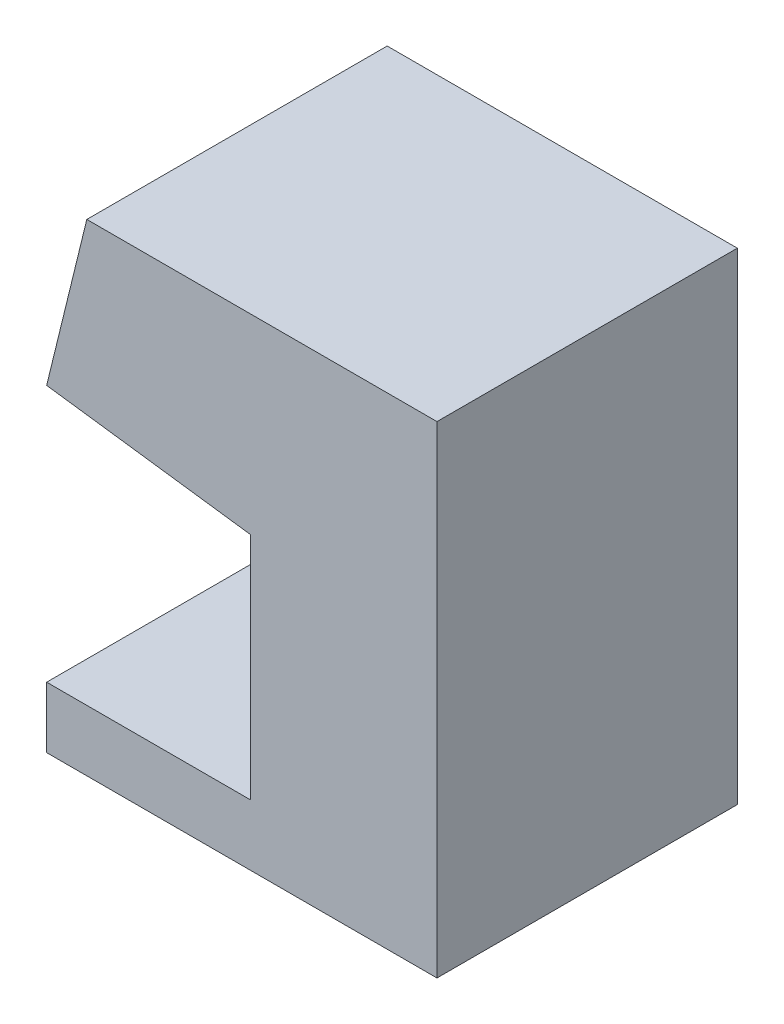
ISO-10303-21;
HEADER;
FILE_DESCRIPTION(('STEP AP214'),'2;1');
FILE_NAME('part.step','',(''),(''),'','','');
FILE_SCHEMA(('AUTOMOTIVE_DESIGN { 1 0 10303 214 1 1 1 1 }'));
ENDSEC;
DATA;
#1=APPLICATION_CONTEXT('core data for automotive mechanical design processes');
#2=APPLICATION_PROTOCOL_DEFINITION('international standard','automotive_design',2000,#1);
#3=PRODUCT_CONTEXT('',#1,'mechanical');
#4=PRODUCT('Part','Part','',(#3));
#5=PRODUCT_RELATED_PRODUCT_CATEGORY('part','',(#4));
#6=PRODUCT_DEFINITION_FORMATION('','',#4);
#7=PRODUCT_DEFINITION_CONTEXT('part definition',#1,'design');
#8=PRODUCT_DEFINITION('design','',#6,#7);
#9=PRODUCT_DEFINITION_SHAPE('','',#8);
#10=(LENGTH_UNIT() NAMED_UNIT(*) SI_UNIT(.MILLI.,.METRE.));
#11=(NAMED_UNIT(*) PLANE_ANGLE_UNIT() SI_UNIT($,.RADIAN.));
#12=(NAMED_UNIT(*) SI_UNIT($,.STERADIAN.) SOLID_ANGLE_UNIT());
#13=UNCERTAINTY_MEASURE_WITH_UNIT(LENGTH_MEASURE(1.E-05),#10,'distance_accuracy_value','');
#14=(GEOMETRIC_REPRESENTATION_CONTEXT(3) GLOBAL_UNCERTAINTY_ASSIGNED_CONTEXT((#13)) GLOBAL_UNIT_ASSIGNED_CONTEXT((#10,
#11,#12)) REPRESENTATION_CONTEXT('',''));
#15=CARTESIAN_POINT('',(0.,0.,0.));
#16=DIRECTION('',(0.,0.,1.));
#17=DIRECTION('',(1.,0.,0.));
#18=AXIS2_PLACEMENT_3D('',#15,#16,#17);
#19=CARTESIAN_POINT('',(0.,38.,187.));
#20=DIRECTION('',(1.,0.,0.));
#21=DIRECTION('',(0.,1.,0.));
#22=AXIS2_PLACEMENT_3D('',#19,#20,#21);
#23=PLANE('',#22);
#24=DIRECTION('',(0.,-1.,0.));
#25=VECTOR('',#24,1.);
#26=CARTESIAN_POINT('',(0.,38.,0.));
#27=LINE('',#26,#25);
#28=CARTESIAN_POINT('',(0.,38.,0.));
#29=VERTEX_POINT('',#28);
#30=CARTESIAN_POINT('',(0.,0.,0.));
#31=VERTEX_POINT('',#30);
#32=EDGE_CURVE('E133',#29,#31,#27,.T.);
#33=ORIENTED_EDGE('',*,*,#32,.T.);
#34=DIRECTION('',(0.,0.,-1.));
#35=VECTOR('',#34,1.);
#36=CARTESIAN_POINT('',(0.,0.,187.));
#37=LINE('',#36,#35);
#38=CARTESIAN_POINT('',(0.,0.,187.));
#39=VERTEX_POINT('',#38);
#40=EDGE_CURVE('E11',#39,#31,#37,.T.);
#41=ORIENTED_EDGE('',*,*,#40,.F.);
#42=DIRECTION('',(0.,-1.,0.));
#43=VECTOR('',#42,1.);
#44=CARTESIAN_POINT('',(0.,38.,187.));
#45=LINE('',#44,#43);
#46=CARTESIAN_POINT('',(0.,38.,187.));
#47=VERTEX_POINT('',#46);
#48=EDGE_CURVE('E147',#47,#39,#45,.T.);
#49=ORIENTED_EDGE('',*,*,#48,.F.);
#50=DIRECTION('',(0.,0.,-1.));
#51=VECTOR('',#50,1.);
#52=CARTESIAN_POINT('',(0.,38.,187.));
#53=LINE('',#52,#51);
#54=EDGE_CURVE('E129',#47,#29,#53,.T.);
#55=ORIENTED_EDGE('',*,*,#54,.T.);
#56=EDGE_LOOP('',(#33,#41,#49,#55));
#57=FACE_BOUND('',#56,.T.);
#58=ADVANCED_FACE('F37',(#57),#23,.F.);
#59=CARTESIAN_POINT('',(0.,0.,187.));
#60=DIRECTION('',(0.,1.,0.));
#61=DIRECTION('',(0.,0.,1.));
#62=AXIS2_PLACEMENT_3D('',#59,#60,#61);
#63=PLANE('',#62);
#64=DIRECTION('',(1.,0.,0.));
#65=VECTOR('',#64,1.);
#66=CARTESIAN_POINT('',(0.,0.,0.));
#67=LINE('',#66,#65);
#68=CARTESIAN_POINT('',(243.,0.,0.));
#69=VERTEX_POINT('',#68);
#70=EDGE_CURVE('E136',#31,#69,#67,.T.);
#71=ORIENTED_EDGE('',*,*,#70,.T.);
#72=DIRECTION('',(0.,0.,-1.));
#73=VECTOR('',#72,1.);
#74=CARTESIAN_POINT('',(243.,0.,187.));
#75=LINE('',#74,#73);
#76=CARTESIAN_POINT('',(243.,0.,187.));
#77=VERTEX_POINT('',#76);
#78=EDGE_CURVE('E45',#77,#69,#75,.T.);
#79=ORIENTED_EDGE('',*,*,#78,.F.);
#80=DIRECTION('',(1.,0.,0.));
#81=VECTOR('',#80,1.);
#82=CARTESIAN_POINT('',(0.,0.,187.));
#83=LINE('',#82,#81);
#84=EDGE_CURVE('E96',#39,#77,#83,.T.);
#85=ORIENTED_EDGE('',*,*,#84,.F.);
#86=ORIENTED_EDGE('',*,*,#40,.T.);
#87=EDGE_LOOP('',(#71,#79,#85,#86));
#88=FACE_BOUND('',#87,.T.);
#89=ADVANCED_FACE('F182',(#88),#63,.F.);
#90=CARTESIAN_POINT('',(243.,0.,187.));
#91=DIRECTION('',(-1.,0.,0.));
#92=DIRECTION('',(0.,-1.,0.));
#93=AXIS2_PLACEMENT_3D('',#90,#91,#92);
#94=PLANE('',#93);
#95=DIRECTION('',(0.,1.,0.));
#96=VECTOR('',#95,1.);
#97=CARTESIAN_POINT('',(243.,0.,0.));
#98=LINE('',#97,#96);
#99=CARTESIAN_POINT('',(243.,300.,0.));
#100=VERTEX_POINT('',#99);
#101=EDGE_CURVE('E138',#69,#100,#98,.T.);
#102=ORIENTED_EDGE('',*,*,#101,.T.);
#103=DIRECTION('',(0.,0.,-1.));
#104=VECTOR('',#103,1.);
#105=CARTESIAN_POINT('',(243.,300.,187.));
#106=LINE('',#105,#104);
#107=CARTESIAN_POINT('',(243.,300.,187.));
#108=VERTEX_POINT('',#107);
#109=EDGE_CURVE('E154',#108,#100,#106,.T.);
#110=ORIENTED_EDGE('',*,*,#109,.F.);
#111=DIRECTION('',(0.,1.,0.));
#112=VECTOR('',#111,1.);
#113=CARTESIAN_POINT('',(243.,0.,187.));
#114=LINE('',#113,#112);
#115=EDGE_CURVE('E162',#77,#108,#114,.T.);
#116=ORIENTED_EDGE('',*,*,#115,.F.);
#117=ORIENTED_EDGE('',*,*,#78,.T.);
#118=EDGE_LOOP('',(#102,#110,#116,#117));
#119=FACE_BOUND('',#118,.T.);
#120=ADVANCED_FACE('F160',(#119),#94,.F.);
#121=CARTESIAN_POINT('',(243.,300.,187.));
#122=DIRECTION('',(0.,-1.,0.));
#123=DIRECTION('',(1.,0.,0.));
#124=AXIS2_PLACEMENT_3D('',#121,#122,#123);
#125=PLANE('',#124);
#126=DIRECTION('',(-1.,0.,0.));
#127=VECTOR('',#126,1.);
#128=CARTESIAN_POINT('',(243.,300.,0.));
#129=LINE('',#128,#127);
#130=CARTESIAN_POINT('',(24.9999999999999,300.,0.));
#131=VERTEX_POINT('',#130);
#132=EDGE_CURVE('E140',#100,#131,#129,.T.);
#133=ORIENTED_EDGE('',*,*,#132,.T.);
#134=DIRECTION('',(0.,0.,-1.));
#135=VECTOR('',#134,1.);
#136=CARTESIAN_POINT('',(24.9999999999999,300.,187.));
#137=LINE('',#136,#135);
#138=CARTESIAN_POINT('',(24.9999999999999,300.,187.));
#139=VERTEX_POINT('',#138);
#140=EDGE_CURVE('E151',#139,#131,#137,.T.);
#141=ORIENTED_EDGE('',*,*,#140,.F.);
#142=DIRECTION('',(-1.,0.,0.));
#143=VECTOR('',#142,1.);
#144=CARTESIAN_POINT('',(243.,300.,187.));
#145=LINE('',#144,#143);
#146=EDGE_CURVE('E174',#108,#139,#145,.T.);
#147=ORIENTED_EDGE('',*,*,#146,.F.);
#148=ORIENTED_EDGE('',*,*,#109,.T.);
#149=EDGE_LOOP('',(#133,#141,#147,#148));
#150=FACE_BOUND('',#149,.T.);
#151=ADVANCED_FACE('F170',(#150),#125,.F.);
#152=CARTESIAN_POINT('',(24.9999999999999,300.,187.));
#153=DIRECTION('',(0.971252396495779,-0.238052057964651,0.));
#154=DIRECTION('',(0.238052057964651,0.971252396495779,0.));
#155=AXIS2_PLACEMENT_3D('',#152,#153,#154);
#156=PLANE('',#155);
#157=DIRECTION('',(-0.238052057964651,-0.971252396495779,0.));
#158=VECTOR('',#157,1.);
#159=CARTESIAN_POINT('',(24.9999999999999,300.,0.));
#160=LINE('',#159,#158);
#161=CARTESIAN_POINT('',(0.,198.,0.));
#162=VERTEX_POINT('',#161);
#163=EDGE_CURVE('E142',#131,#162,#160,.T.);
#164=ORIENTED_EDGE('',*,*,#163,.T.);
#165=DIRECTION('',(0.,0.,-1.));
#166=VECTOR('',#165,1.);
#167=CARTESIAN_POINT('',(0.,198.,187.));
#168=LINE('',#167,#166);
#169=CARTESIAN_POINT('',(0.,198.,187.));
#170=VERTEX_POINT('',#169);
#171=EDGE_CURVE('E124',#170,#162,#168,.T.);
#172=ORIENTED_EDGE('',*,*,#171,.F.);
#173=DIRECTION('',(-0.238052057964651,-0.971252396495779,0.));
#174=VECTOR('',#173,1.);
#175=CARTESIAN_POINT('',(24.9999999999999,300.,187.));
#176=LINE('',#175,#174);
#177=EDGE_CURVE('E115',#139,#170,#176,.T.);
#178=ORIENTED_EDGE('',*,*,#177,.F.);
#179=ORIENTED_EDGE('',*,*,#140,.T.);
#180=EDGE_LOOP('',(#164,#172,#178,#179));
#181=FACE_BOUND('',#180,.T.);
#182=ADVANCED_FACE('F173',(#181),#156,.F.);
#183=CARTESIAN_POINT('',(0.,198.,187.));
#184=DIRECTION('',(0.132674908171722,0.991159608106396,0.));
#185=DIRECTION('',(-0.991159608106396,0.132674908171722,0.));
#186=AXIS2_PLACEMENT_3D('',#183,#184,#185);
#187=PLANE('',#186);
#188=DIRECTION('',(0.991159608106396,-0.132674908171722,0.));
#189=VECTOR('',#188,1.);
#190=CARTESIAN_POINT('',(0.,198.,0.));
#191=LINE('',#190,#189);
#192=CARTESIAN_POINT('',(127.,181.,0.));
#193=VERTEX_POINT('',#192);
#194=EDGE_CURVE('E123',#162,#193,#191,.T.);
#195=ORIENTED_EDGE('',*,*,#194,.T.);
#196=DIRECTION('',(0.,0.,-1.));
#197=VECTOR('',#196,1.);
#198=CARTESIAN_POINT('',(127.,181.,187.));
#199=LINE('',#198,#197);
#200=CARTESIAN_POINT('',(127.,181.,187.));
#201=VERTEX_POINT('',#200);
#202=EDGE_CURVE('E120',#201,#193,#199,.T.);
#203=ORIENTED_EDGE('',*,*,#202,.F.);
#204=DIRECTION('',(0.991159608106396,-0.132674908171722,0.));
#205=VECTOR('',#204,1.);
#206=CARTESIAN_POINT('',(0.,198.,187.));
#207=LINE('',#206,#205);
#208=EDGE_CURVE('E109',#170,#201,#207,.T.);
#209=ORIENTED_EDGE('',*,*,#208,.F.);
#210=ORIENTED_EDGE('',*,*,#171,.T.);
#211=EDGE_LOOP('',(#195,#203,#209,#210));
#212=FACE_BOUND('',#211,.T.);
#213=ADVANCED_FACE('F121',(#212),#187,.F.);
#214=CARTESIAN_POINT('',(127.,181.,187.));
#215=DIRECTION('',(1.,0.,0.));
#216=DIRECTION('',(0.,1.,0.));
#217=AXIS2_PLACEMENT_3D('',#214,#215,#216);
#218=PLANE('',#217);
#219=DIRECTION('',(0.,-1.,0.));
#220=VECTOR('',#219,1.);
#221=CARTESIAN_POINT('',(127.,181.,0.));
#222=LINE('',#221,#220);
#223=CARTESIAN_POINT('',(127.,38.,0.));
#224=VERTEX_POINT('',#223);
#225=EDGE_CURVE('E82',#193,#224,#222,.T.);
#226=ORIENTED_EDGE('',*,*,#225,.T.);
#227=DIRECTION('',(0.,0.,-1.));
#228=VECTOR('',#227,1.);
#229=CARTESIAN_POINT('',(127.,38.,187.));
#230=LINE('',#229,#228);
#231=CARTESIAN_POINT('',(127.,38.,187.));
#232=VERTEX_POINT('',#231);
#233=EDGE_CURVE('E125',#232,#224,#230,.T.);
#234=ORIENTED_EDGE('',*,*,#233,.F.);
#235=DIRECTION('',(0.,-1.,0.));
#236=VECTOR('',#235,1.);
#237=CARTESIAN_POINT('',(127.,181.,187.));
#238=LINE('',#237,#236);
#239=EDGE_CURVE('E113',#201,#232,#238,.T.);
#240=ORIENTED_EDGE('',*,*,#239,.F.);
#241=ORIENTED_EDGE('',*,*,#202,.T.);
#242=EDGE_LOOP('',(#226,#234,#240,#241));
#243=FACE_BOUND('',#242,.T.);
#244=ADVANCED_FACE('F127',(#243),#218,.F.);
#245=CARTESIAN_POINT('',(127.,38.,187.));
#246=DIRECTION('',(0.,-1.,0.));
#247=DIRECTION('',(1.,0.,0.));
#248=AXIS2_PLACEMENT_3D('',#245,#246,#247);
#249=PLANE('',#248);
#250=DIRECTION('',(-1.,0.,0.));
#251=VECTOR('',#250,1.);
#252=CARTESIAN_POINT('',(127.,38.,0.));
#253=LINE('',#252,#251);
#254=EDGE_CURVE('E88',#224,#29,#253,.T.);
#255=ORIENTED_EDGE('',*,*,#254,.T.);
#256=ORIENTED_EDGE('',*,*,#54,.F.);
#257=DIRECTION('',(-1.,0.,0.));
#258=VECTOR('',#257,1.);
#259=CARTESIAN_POINT('',(127.,38.,187.));
#260=LINE('',#259,#258);
#261=EDGE_CURVE('E53',#232,#47,#260,.T.);
#262=ORIENTED_EDGE('',*,*,#261,.F.);
#263=ORIENTED_EDGE('',*,*,#233,.T.);
#264=EDGE_LOOP('',(#255,#256,#262,#263));
#265=FACE_BOUND('',#264,.T.);
#266=ADVANCED_FACE('F198',(#265),#249,.F.);
#267=CARTESIAN_POINT('',(0.,0.,187.));
#268=DIRECTION('',(0.,0.,1.));
#269=DIRECTION('',(1.,0.,0.));
#270=AXIS2_PLACEMENT_3D('',#267,#268,#269);
#271=PLANE('',#270);
#272=ORIENTED_EDGE('',*,*,#48,.T.);
#273=ORIENTED_EDGE('',*,*,#84,.T.);
#274=ORIENTED_EDGE('',*,*,#115,.T.);
#275=ORIENTED_EDGE('',*,*,#146,.T.);
#276=ORIENTED_EDGE('',*,*,#177,.T.);
#277=ORIENTED_EDGE('',*,*,#208,.T.);
#278=ORIENTED_EDGE('',*,*,#239,.T.);
#279=ORIENTED_EDGE('',*,*,#261,.T.);
#280=EDGE_LOOP('',(#272,#273,#274,#275,#276,#277,#278,#279));
#281=FACE_BOUND('',#280,.T.);
#282=ADVANCED_FACE('F111',(#281),#271,.T.);
#283=CARTESIAN_POINT('',(0.,0.,0.));
#284=DIRECTION('',(0.,0.,1.));
#285=DIRECTION('',(1.,0.,0.));
#286=AXIS2_PLACEMENT_3D('',#283,#284,#285);
#287=PLANE('',#286);
#288=ORIENTED_EDGE('',*,*,#32,.F.);
#289=ORIENTED_EDGE('',*,*,#254,.F.);
#290=ORIENTED_EDGE('',*,*,#225,.F.);
#291=ORIENTED_EDGE('',*,*,#194,.F.);
#292=ORIENTED_EDGE('',*,*,#163,.F.);
#293=ORIENTED_EDGE('',*,*,#132,.F.);
#294=ORIENTED_EDGE('',*,*,#101,.F.);
#295=ORIENTED_EDGE('',*,*,#70,.F.);
#296=EDGE_LOOP('',(#288,#289,#290,#291,#292,#293,#294,#295));
#297=FACE_BOUND('',#296,.T.);
#298=ADVANCED_FACE('F166',(#297),#287,.F.);
#299=CLOSED_SHELL('',(#58,#89,#120,#151,#182,#213,#244,#266,#282,#298));
#300=MANIFOLD_SOLID_BREP('B2',#299);
#301=ADVANCED_BREP_SHAPE_REPRESENTATION('',(#18,#300),#14);
#302=SHAPE_DEFINITION_REPRESENTATION(#9,#301);
ENDSEC;
END-ISO-10303-21;
